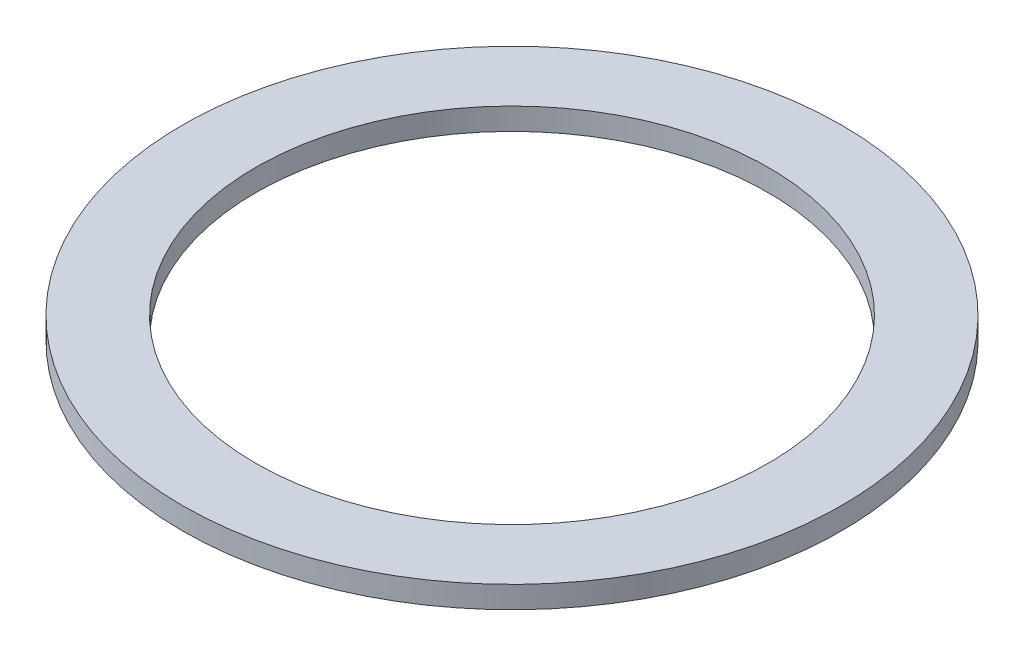
ISO-10303-21;
HEADER;
FILE_DESCRIPTION(('STEP AP214'),'2;1');
FILE_NAME('part.step','',(''),(''),'','','');
FILE_SCHEMA(('AUTOMOTIVE_DESIGN { 1 0 10303 214 1 1 1 1 }'));
ENDSEC;
DATA;
#1=APPLICATION_CONTEXT('core data for automotive mechanical design processes');
#2=APPLICATION_PROTOCOL_DEFINITION('international standard','automotive_design',2000,#1);
#3=PRODUCT_CONTEXT('',#1,'mechanical');
#4=PRODUCT('Part','Part','',(#3));
#5=PRODUCT_RELATED_PRODUCT_CATEGORY('part','',(#4));
#6=PRODUCT_DEFINITION_FORMATION('','',#4);
#7=PRODUCT_DEFINITION_CONTEXT('part definition',#1,'design');
#8=PRODUCT_DEFINITION('design','',#6,#7);
#9=PRODUCT_DEFINITION_SHAPE('','',#8);
#10=(LENGTH_UNIT() NAMED_UNIT(*) SI_UNIT(.MILLI.,.METRE.));
#11=(NAMED_UNIT(*) PLANE_ANGLE_UNIT() SI_UNIT($,.RADIAN.));
#12=(NAMED_UNIT(*) SI_UNIT($,.STERADIAN.) SOLID_ANGLE_UNIT());
#13=UNCERTAINTY_MEASURE_WITH_UNIT(LENGTH_MEASURE(1.E-05),#10,'distance_accuracy_value','');
#14=(GEOMETRIC_REPRESENTATION_CONTEXT(3) GLOBAL_UNCERTAINTY_ASSIGNED_CONTEXT((#13)) GLOBAL_UNIT_ASSIGNED_CONTEXT((#10,
#11,#12)) REPRESENTATION_CONTEXT('',''));
#15=CARTESIAN_POINT('',(0.,0.,0.));
#16=DIRECTION('',(0.,0.,1.));
#17=DIRECTION('',(1.,0.,0.));
#18=AXIS2_PLACEMENT_3D('',#15,#16,#17);
#19=CARTESIAN_POINT('',(0.,3.,0.));
#20=DIRECTION('',(0.,1.,0.));
#21=DIRECTION('',(0.,0.,1.));
#22=AXIS2_PLACEMENT_3D('',#19,#20,#21);
#23=PLANE('',#22);
#24=CARTESIAN_POINT('',(0.,3.,0.));
#25=DIRECTION('',(0.,1.,0.));
#26=DIRECTION('',(0.,0.,1.));
#27=AXIS2_PLACEMENT_3D('',#24,#25,#26);
#28=CIRCLE('',#27,45.);
#29=CARTESIAN_POINT('',(0.,3.,45.));
#30=VERTEX_POINT('',#29);
#31=EDGE_CURVE('E10',#30,#30,#28,.T.);
#32=ORIENTED_EDGE('',*,*,#31,.T.);
#33=EDGE_LOOP('',(#32));
#34=FACE_BOUND('',#33,.T.);
#35=CARTESIAN_POINT('',(0.,3.,0.));
#36=DIRECTION('',(0.,1.,0.));
#37=DIRECTION('',(0.,0.,1.));
#38=AXIS2_PLACEMENT_3D('',#35,#36,#37);
#39=CIRCLE('',#38,35.);
#40=CARTESIAN_POINT('',(0.,3.,35.));
#41=VERTEX_POINT('',#40);
#42=EDGE_CURVE('E41',#41,#41,#39,.T.);
#43=ORIENTED_EDGE('',*,*,#42,.F.);
#44=EDGE_LOOP('',(#43));
#45=FACE_BOUND('',#44,.T.);
#46=ADVANCED_FACE('F30',(#34,#45),#23,.T.);
#47=CARTESIAN_POINT('',(0.,0.,0.));
#48=DIRECTION('',(0.,1.,0.));
#49=DIRECTION('',(0.,0.,1.));
#50=AXIS2_PLACEMENT_3D('',#47,#48,#49);
#51=PLANE('',#50);
#52=CARTESIAN_POINT('',(0.,0.,0.));
#53=DIRECTION('',(0.,1.,0.));
#54=DIRECTION('',(0.,0.,1.));
#55=AXIS2_PLACEMENT_3D('',#52,#53,#54);
#56=CIRCLE('',#55,45.);
#57=CARTESIAN_POINT('',(0.,0.,45.));
#58=VERTEX_POINT('',#57);
#59=EDGE_CURVE('E34',#58,#58,#56,.T.);
#60=ORIENTED_EDGE('',*,*,#59,.F.);
#61=EDGE_LOOP('',(#60));
#62=FACE_BOUND('',#61,.T.);
#63=CARTESIAN_POINT('',(0.,0.,0.));
#64=DIRECTION('',(0.,1.,0.));
#65=DIRECTION('',(0.,0.,1.));
#66=AXIS2_PLACEMENT_3D('',#63,#64,#65);
#67=CIRCLE('',#66,35.);
#68=CARTESIAN_POINT('',(0.,0.,35.));
#69=VERTEX_POINT('',#68);
#70=EDGE_CURVE('E43',#69,#69,#67,.T.);
#71=ORIENTED_EDGE('',*,*,#70,.T.);
#72=EDGE_LOOP('',(#71));
#73=FACE_BOUND('',#72,.T.);
#74=ADVANCED_FACE('F53',(#62,#73),#51,.F.);
#75=CARTESIAN_POINT('',(0.,3.,0.));
#76=DIRECTION('',(0.,-1.,0.));
#77=DIRECTION('',(0.,0.,-1.));
#78=AXIS2_PLACEMENT_3D('',#75,#76,#77);
#79=CYLINDRICAL_SURFACE('',#78,45.);
#80=ORIENTED_EDGE('',*,*,#31,.F.);
#81=EDGE_LOOP('',(#80));
#82=FACE_BOUND('',#81,.T.);
#83=ORIENTED_EDGE('',*,*,#59,.T.);
#84=EDGE_LOOP('',(#83));
#85=FACE_BOUND('',#84,.T.);
#86=ADVANCED_FACE('F32',(#82,#85),#79,.T.);
#87=CARTESIAN_POINT('',(0.,3.,0.));
#88=DIRECTION('',(0.,-1.,0.));
#89=DIRECTION('',(0.,0.,-1.));
#90=AXIS2_PLACEMENT_3D('',#87,#88,#89);
#91=CYLINDRICAL_SURFACE('',#90,35.);
#92=ORIENTED_EDGE('',*,*,#42,.T.);
#93=EDGE_LOOP('',(#92));
#94=FACE_BOUND('',#93,.T.);
#95=ORIENTED_EDGE('',*,*,#70,.F.);
#96=EDGE_LOOP('',(#95));
#97=FACE_BOUND('',#96,.T.);
#98=ADVANCED_FACE('F49',(#94,#97),#91,.F.);
#99=CLOSED_SHELL('',(#46,#74,#86,#98));
#100=MANIFOLD_SOLID_BREP('B2',#99);
#101=ADVANCED_BREP_SHAPE_REPRESENTATION('',(#18,#100),#14);
#102=SHAPE_DEFINITION_REPRESENTATION(#9,#101);
ENDSEC;
END-ISO-10303-21;
